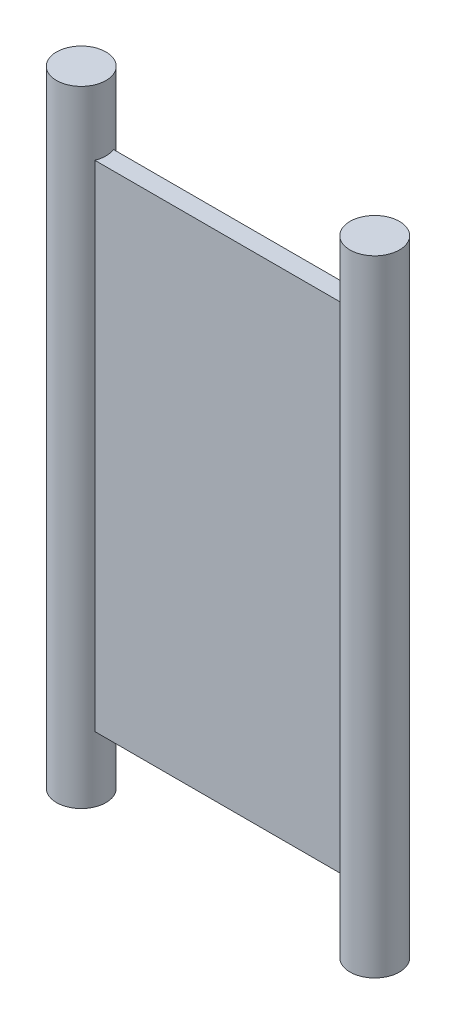
ISO-10303-21;
HEADER;
FILE_DESCRIPTION(('STEP AP214'),'2;1');
FILE_NAME('part.step','',(''),(''),'','','');
FILE_SCHEMA(('AUTOMOTIVE_DESIGN { 1 0 10303 214 1 1 1 1 }'));
ENDSEC;
DATA;
#1=APPLICATION_CONTEXT('core data for automotive mechanical design processes');
#2=APPLICATION_PROTOCOL_DEFINITION('international standard','automotive_design',2000,#1);
#3=PRODUCT_CONTEXT('',#1,'mechanical');
#4=PRODUCT('Part','Part','',(#3));
#5=PRODUCT_RELATED_PRODUCT_CATEGORY('part','',(#4));
#6=PRODUCT_DEFINITION_FORMATION('','',#4);
#7=PRODUCT_DEFINITION_CONTEXT('part definition',#1,'design');
#8=PRODUCT_DEFINITION('design','',#6,#7);
#9=PRODUCT_DEFINITION_SHAPE('','',#8);
#10=(LENGTH_UNIT() NAMED_UNIT(*) SI_UNIT(.MILLI.,.METRE.));
#11=(NAMED_UNIT(*) PLANE_ANGLE_UNIT() SI_UNIT($,.RADIAN.));
#12=(NAMED_UNIT(*) SI_UNIT($,.STERADIAN.) SOLID_ANGLE_UNIT());
#13=UNCERTAINTY_MEASURE_WITH_UNIT(LENGTH_MEASURE(1.E-05),#10,'distance_accuracy_value','');
#14=(GEOMETRIC_REPRESENTATION_CONTEXT(3) GLOBAL_UNCERTAINTY_ASSIGNED_CONTEXT((#13)) GLOBAL_UNIT_ASSIGNED_CONTEXT((#10,
#11,#12)) REPRESENTATION_CONTEXT('',''));
#15=CARTESIAN_POINT('',(0.,0.,0.));
#16=DIRECTION('',(0.,0.,1.));
#17=DIRECTION('',(1.,0.,0.));
#18=AXIS2_PLACEMENT_3D('',#15,#16,#17);
#19=CARTESIAN_POINT('',(7.86,26.5,0.499999999999999));
#20=DIRECTION('',(0.,0.,-1.));
#21=DIRECTION('',(-1.,0.,0.));
#22=AXIS2_PLACEMENT_3D('',#19,#20,#21);
#23=PLANE('',#22);
#24=DIRECTION('',(0.,-1.,0.));
#25=VECTOR('',#24,1.);
#26=CARTESIAN_POINT('',(6.6329608808192,30.,0.499999999999999));
#27=LINE('',#26,#25);
#28=CARTESIAN_POINT('',(6.6329608808192,26.5,0.499999999999999));
#29=VERTEX_POINT('',#28);
#30=CARTESIAN_POINT('',(6.6329608808192,0.,0.499999999999999));
#31=VERTEX_POINT('',#30);
#32=EDGE_CURVE('E53',#29,#31,#27,.T.);
#33=ORIENTED_EDGE('',*,*,#32,.F.);
#34=DIRECTION('',(1.,0.,0.));
#35=VECTOR('',#34,1.);
#36=CARTESIAN_POINT('',(7.86,26.5,0.499999999999999));
#37=LINE('',#36,#35);
#38=CARTESIAN_POINT('',(-6.6329608808192,26.5,0.500000000000001));
#39=VERTEX_POINT('',#38);
#40=EDGE_CURVE('E90',#39,#29,#37,.T.);
#41=ORIENTED_EDGE('',*,*,#40,.F.);
#42=DIRECTION('',(0.,-1.,0.));
#43=VECTOR('',#42,1.);
#44=CARTESIAN_POINT('',(-6.6329608808192,30.,0.500000000000001));
#45=LINE('',#44,#43);
#46=CARTESIAN_POINT('',(-6.6329608808192,0.,0.500000000000001));
#47=VERTEX_POINT('',#46);
#48=EDGE_CURVE('E103',#47,#39,#45,.F.);
#49=ORIENTED_EDGE('',*,*,#48,.F.);
#50=DIRECTION('',(1.,0.,0.));
#51=VECTOR('',#50,1.);
#52=CARTESIAN_POINT('',(7.86,0.,0.499999999999999));
#53=LINE('',#52,#51);
#54=EDGE_CURVE('E91',#47,#31,#53,.T.);
#55=ORIENTED_EDGE('',*,*,#54,.T.);
#56=EDGE_LOOP('',(#33,#41,#49,#55));
#57=FACE_BOUND('',#56,.T.);
#58=ADVANCED_FACE('F39',(#57),#23,.F.);
#59=CARTESIAN_POINT('',(7.86,26.5,-0.500000000000001));
#60=DIRECTION('',(0.,0.,1.));
#61=DIRECTION('',(1.,0.,0.));
#62=AXIS2_PLACEMENT_3D('',#59,#60,#61);
#63=PLANE('',#62);
#64=DIRECTION('',(0.,-1.,0.));
#65=VECTOR('',#64,1.);
#66=CARTESIAN_POINT('',(6.6329608808192,30.,-0.500000000000001));
#67=LINE('',#66,#65);
#68=CARTESIAN_POINT('',(6.6329608808192,0.,-0.500000000000001));
#69=VERTEX_POINT('',#68);
#70=CARTESIAN_POINT('',(6.6329608808192,26.5,-0.500000000000001));
#71=VERTEX_POINT('',#70);
#72=EDGE_CURVE('E78',#69,#71,#67,.F.);
#73=ORIENTED_EDGE('',*,*,#72,.F.);
#74=DIRECTION('',(-1.,0.,0.));
#75=VECTOR('',#74,1.);
#76=CARTESIAN_POINT('',(7.86,0.,-0.500000000000001));
#77=LINE('',#76,#75);
#78=CARTESIAN_POINT('',(-6.63296088081919,0.,-0.499999999999999));
#79=VERTEX_POINT('',#78);
#80=EDGE_CURVE('E60',#69,#79,#77,.T.);
#81=ORIENTED_EDGE('',*,*,#80,.T.);
#82=DIRECTION('',(0.,-1.,0.));
#83=VECTOR('',#82,1.);
#84=CARTESIAN_POINT('',(-6.63296088081919,30.,-0.499999999999999));
#85=LINE('',#84,#83);
#86=CARTESIAN_POINT('',(-6.63296088081919,26.5,-0.499999999999999));
#87=VERTEX_POINT('',#86);
#88=EDGE_CURVE('E105',#87,#79,#85,.T.);
#89=ORIENTED_EDGE('',*,*,#88,.F.);
#90=DIRECTION('',(-1.,0.,0.));
#91=VECTOR('',#90,1.);
#92=CARTESIAN_POINT('',(7.86,26.5,-0.500000000000001));
#93=LINE('',#92,#91);
#94=EDGE_CURVE('E85',#71,#87,#93,.T.);
#95=ORIENTED_EDGE('',*,*,#94,.F.);
#96=EDGE_LOOP('',(#73,#81,#89,#95));
#97=FACE_BOUND('',#96,.T.);
#98=ADVANCED_FACE('F84',(#97),#63,.F.);
#99=CARTESIAN_POINT('',(-7.86,30.,0.));
#100=DIRECTION('',(0.,-1.,0.));
#101=DIRECTION('',(0.,0.,-1.));
#102=AXIS2_PLACEMENT_3D('',#99,#100,#101);
#103=CYLINDRICAL_SURFACE('',#102,1.325);
#104=CARTESIAN_POINT('',(-7.86,30.,0.));
#105=DIRECTION('',(0.,1.,0.));
#106=DIRECTION('',(0.,0.,1.));
#107=AXIS2_PLACEMENT_3D('',#104,#105,#106);
#108=CIRCLE('',#107,1.325);
#109=CARTESIAN_POINT('',(-7.86,30.,1.325));
#110=VERTEX_POINT('',#109);
#111=EDGE_CURVE('E107',#110,#110,#108,.T.);
#112=ORIENTED_EDGE('',*,*,#111,.F.);
#113=EDGE_LOOP('',(#112));
#114=FACE_BOUND('',#113,.T.);
#115=CARTESIAN_POINT('',(-7.86,-3.5,0.));
#116=DIRECTION('',(0.,1.,0.));
#117=DIRECTION('',(0.,0.,1.));
#118=AXIS2_PLACEMENT_3D('',#115,#116,#117);
#119=CIRCLE('',#118,1.325);
#120=CARTESIAN_POINT('',(-7.86,-3.5,1.325));
#121=VERTEX_POINT('',#120);
#122=EDGE_CURVE('E108',#121,#121,#119,.T.);
#123=ORIENTED_EDGE('',*,*,#122,.T.);
#124=EDGE_LOOP('',(#123));
#125=FACE_BOUND('',#124,.T.);
#126=ORIENTED_EDGE('',*,*,#48,.T.);
#127=CARTESIAN_POINT('',(-7.86,26.5,0.));
#128=DIRECTION('',(0.,-1.,0.));
#129=DIRECTION('',(0.,0.,-1.));
#130=AXIS2_PLACEMENT_3D('',#127,#128,#129);
#131=CIRCLE('',#130,1.325);
#132=EDGE_CURVE('E95',#39,#87,#131,.F.);
#133=ORIENTED_EDGE('',*,*,#132,.T.);
#134=ORIENTED_EDGE('',*,*,#88,.T.);
#135=CARTESIAN_POINT('',(-7.86,0.,0.));
#136=DIRECTION('',(0.,-1.,0.));
#137=DIRECTION('',(0.,0.,-1.));
#138=AXIS2_PLACEMENT_3D('',#135,#136,#137);
#139=CIRCLE('',#138,1.325);
#140=EDGE_CURVE('E46',#47,#79,#139,.F.);
#141=ORIENTED_EDGE('',*,*,#140,.F.);
#142=EDGE_LOOP('',(#126,#133,#134,#141));
#143=FACE_BOUND('',#142,.T.);
#144=ADVANCED_FACE('F138',(#114,#125,#143),#103,.T.);
#145=CARTESIAN_POINT('',(-7.86,30.,0.));
#146=DIRECTION('',(0.,1.,0.));
#147=DIRECTION('',(0.,0.,1.));
#148=AXIS2_PLACEMENT_3D('',#145,#146,#147);
#149=PLANE('',#148);
#150=ORIENTED_EDGE('',*,*,#111,.T.);
#151=EDGE_LOOP('',(#150));
#152=FACE_BOUND('',#151,.T.);
#153=ADVANCED_FACE('F144',(#152),#149,.T.);
#154=CARTESIAN_POINT('',(-7.86,-3.5,0.));
#155=DIRECTION('',(0.,1.,0.));
#156=DIRECTION('',(0.,0.,1.));
#157=AXIS2_PLACEMENT_3D('',#154,#155,#156);
#158=PLANE('',#157);
#159=ORIENTED_EDGE('',*,*,#122,.F.);
#160=EDGE_LOOP('',(#159));
#161=FACE_BOUND('',#160,.T.);
#162=ADVANCED_FACE('F150',(#161),#158,.F.);
#163=CARTESIAN_POINT('',(0.,26.5,0.));
#164=DIRECTION('',(0.,-1.,0.));
#165=DIRECTION('',(0.,0.,-1.));
#166=AXIS2_PLACEMENT_3D('',#163,#164,#165);
#167=PLANE('',#166);
#168=CARTESIAN_POINT('',(7.86,26.5,0.));
#169=DIRECTION('',(0.,-1.,0.));
#170=DIRECTION('',(0.,0.,-1.));
#171=AXIS2_PLACEMENT_3D('',#168,#169,#170);
#172=CIRCLE('',#171,1.325);
#173=EDGE_CURVE('E111',#71,#29,#172,.F.);
#174=ORIENTED_EDGE('',*,*,#173,.F.);
#175=ORIENTED_EDGE('',*,*,#94,.T.);
#176=ORIENTED_EDGE('',*,*,#132,.F.);
#177=ORIENTED_EDGE('',*,*,#40,.T.);
#178=EDGE_LOOP('',(#174,#175,#176,#177));
#179=FACE_BOUND('',#178,.T.);
#180=ADVANCED_FACE('F141',(#179),#167,.F.);
#181=CARTESIAN_POINT('',(0.,0.,0.));
#182=DIRECTION('',(0.,-1.,0.));
#183=DIRECTION('',(0.,0.,-1.));
#184=AXIS2_PLACEMENT_3D('',#181,#182,#183);
#185=PLANE('',#184);
#186=ORIENTED_EDGE('',*,*,#80,.F.);
#187=CARTESIAN_POINT('',(7.86,0.,0.));
#188=DIRECTION('',(0.,-1.,0.));
#189=DIRECTION('',(0.,0.,-1.));
#190=AXIS2_PLACEMENT_3D('',#187,#188,#189);
#191=CIRCLE('',#190,1.325);
#192=EDGE_CURVE('E11',#69,#31,#191,.F.);
#193=ORIENTED_EDGE('',*,*,#192,.T.);
#194=ORIENTED_EDGE('',*,*,#54,.F.);
#195=ORIENTED_EDGE('',*,*,#140,.T.);
#196=EDGE_LOOP('',(#186,#193,#194,#195));
#197=FACE_BOUND('',#196,.T.);
#198=ADVANCED_FACE('F89',(#197),#185,.T.);
#199=CARTESIAN_POINT('',(7.86,30.,0.));
#200=DIRECTION('',(0.,-1.,0.));
#201=DIRECTION('',(0.,0.,-1.));
#202=AXIS2_PLACEMENT_3D('',#199,#200,#201);
#203=CYLINDRICAL_SURFACE('',#202,1.325);
#204=CARTESIAN_POINT('',(7.86,30.,0.));
#205=DIRECTION('',(0.,1.,0.));
#206=DIRECTION('',(0.,0.,1.));
#207=AXIS2_PLACEMENT_3D('',#204,#205,#206);
#208=CIRCLE('',#207,1.325);
#209=CARTESIAN_POINT('',(7.86,30.,1.325));
#210=VERTEX_POINT('',#209);
#211=EDGE_CURVE('E116',#210,#210,#208,.T.);
#212=ORIENTED_EDGE('',*,*,#211,.F.);
#213=EDGE_LOOP('',(#212));
#214=FACE_BOUND('',#213,.T.);
#215=CARTESIAN_POINT('',(7.86,-3.5,0.));
#216=DIRECTION('',(0.,1.,0.));
#217=DIRECTION('',(0.,0.,1.));
#218=AXIS2_PLACEMENT_3D('',#215,#216,#217);
#219=CIRCLE('',#218,1.325);
#220=CARTESIAN_POINT('',(7.86,-3.5,1.325));
#221=VERTEX_POINT('',#220);
#222=EDGE_CURVE('E86',#221,#221,#219,.T.);
#223=ORIENTED_EDGE('',*,*,#222,.T.);
#224=EDGE_LOOP('',(#223));
#225=FACE_BOUND('',#224,.T.);
#226=ORIENTED_EDGE('',*,*,#72,.T.);
#227=ORIENTED_EDGE('',*,*,#173,.T.);
#228=ORIENTED_EDGE('',*,*,#32,.T.);
#229=ORIENTED_EDGE('',*,*,#192,.F.);
#230=EDGE_LOOP('',(#226,#227,#228,#229));
#231=FACE_BOUND('',#230,.T.);
#232=ADVANCED_FACE('F77',(#214,#225,#231),#203,.T.);
#233=CARTESIAN_POINT('',(7.86,30.,0.));
#234=DIRECTION('',(0.,1.,0.));
#235=DIRECTION('',(0.,0.,1.));
#236=AXIS2_PLACEMENT_3D('',#233,#234,#235);
#237=PLANE('',#236);
#238=ORIENTED_EDGE('',*,*,#211,.T.);
#239=EDGE_LOOP('',(#238));
#240=FACE_BOUND('',#239,.T.);
#241=ADVANCED_FACE('F125',(#240),#237,.T.);
#242=CARTESIAN_POINT('',(7.86,-3.5,0.));
#243=DIRECTION('',(0.,1.,0.));
#244=DIRECTION('',(0.,0.,1.));
#245=AXIS2_PLACEMENT_3D('',#242,#243,#244);
#246=PLANE('',#245);
#247=ORIENTED_EDGE('',*,*,#222,.F.);
#248=EDGE_LOOP('',(#247));
#249=FACE_BOUND('',#248,.T.);
#250=ADVANCED_FACE('F123',(#249),#246,.F.);
#251=CLOSED_SHELL('',(#58,#98,#144,#153,#162,#180,#198,#232,#241,#250));
#252=MANIFOLD_SOLID_BREP('B2',#251);
#253=ADVANCED_BREP_SHAPE_REPRESENTATION('',(#18,#252),#14);
#254=SHAPE_DEFINITION_REPRESENTATION(#9,#253);
ENDSEC;
END-ISO-10303-21;
